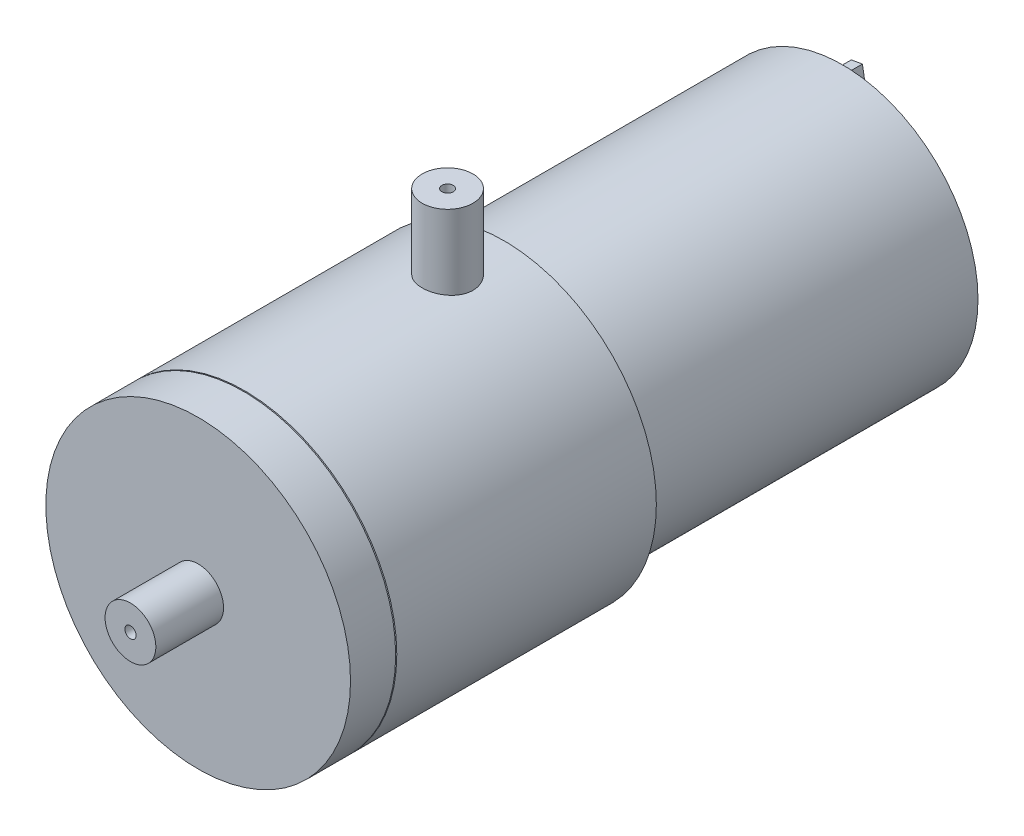
ISO-10303-21;
HEADER;
FILE_DESCRIPTION(('STEP AP214'),'2;1');
FILE_NAME('part.step','',(''),(''),'','','');
FILE_SCHEMA(('AUTOMOTIVE_DESIGN { 1 0 10303 214 1 1 1 1 }'));
ENDSEC;
DATA;
#1=APPLICATION_CONTEXT('core data for automotive mechanical design processes');
#2=APPLICATION_PROTOCOL_DEFINITION('international standard','automotive_design',2000,#1);
#3=PRODUCT_CONTEXT('',#1,'mechanical');
#4=PRODUCT('Part','Part','',(#3));
#5=PRODUCT_RELATED_PRODUCT_CATEGORY('part','',(#4));
#6=PRODUCT_DEFINITION_FORMATION('','',#4);
#7=PRODUCT_DEFINITION_CONTEXT('part definition',#1,'design');
#8=PRODUCT_DEFINITION('design','',#6,#7);
#9=PRODUCT_DEFINITION_SHAPE('','',#8);
#10=(LENGTH_UNIT() NAMED_UNIT(*) SI_UNIT(.MILLI.,.METRE.));
#11=(NAMED_UNIT(*) PLANE_ANGLE_UNIT() SI_UNIT($,.RADIAN.));
#12=(NAMED_UNIT(*) SI_UNIT($,.STERADIAN.) SOLID_ANGLE_UNIT());
#13=UNCERTAINTY_MEASURE_WITH_UNIT(LENGTH_MEASURE(1.E-05),#10,'distance_accuracy_value','');
#14=(GEOMETRIC_REPRESENTATION_CONTEXT(3) GLOBAL_UNCERTAINTY_ASSIGNED_CONTEXT((#13)) GLOBAL_UNIT_ASSIGNED_CONTEXT((#10,
#11,#12)) REPRESENTATION_CONTEXT('',''));
#15=CARTESIAN_POINT('',(0.,0.,0.));
#16=DIRECTION('',(0.,0.,1.));
#17=DIRECTION('',(1.,0.,0.));
#18=AXIS2_PLACEMENT_3D('',#15,#16,#17);
#19=CARTESIAN_POINT('',(0.,0.,-28.));
#20=DIRECTION('',(0.,0.,-1.));
#21=DIRECTION('',(-1.,0.,0.));
#22=AXIS2_PLACEMENT_3D('',#19,#20,#21);
#23=PLANE('',#22);
#24=CARTESIAN_POINT('',(0.,0.,-28.));
#25=DIRECTION('',(0.,0.,-1.));
#26=DIRECTION('',(-1.,0.,0.));
#27=AXIS2_PLACEMENT_3D('',#24,#25,#26);
#28=CIRCLE('',#27,3.);
#29=CARTESIAN_POINT('',(-3.,0.,-28.));
#30=VERTEX_POINT('',#29);
#31=EDGE_CURVE('E241',#30,#30,#28,.T.);
#32=ORIENTED_EDGE('',*,*,#31,.F.);
#33=EDGE_LOOP('',(#32));
#34=FACE_BOUND('',#33,.T.);
#35=CARTESIAN_POINT('',(0.,0.,-28.));
#36=DIRECTION('',(0.,0.,-1.));
#37=DIRECTION('',(-1.,0.,0.));
#38=AXIS2_PLACEMENT_3D('',#35,#36,#37);
#39=CIRCLE('',#38,11.5);
#40=CARTESIAN_POINT('',(-11.5,0.,-28.));
#41=VERTEX_POINT('',#40);
#42=EDGE_CURVE('E244',#41,#41,#39,.T.);
#43=ORIENTED_EDGE('',*,*,#42,.T.);
#44=EDGE_LOOP('',(#43));
#45=FACE_BOUND('',#44,.T.);
#46=DIRECTION('',(-0.984807753012208,-0.173648177666933,0.));
#47=VECTOR('',#46,1.);
#48=CARTESIAN_POINT('',(2.22888565317541,-9.76125344128861,-28.));
#49=LINE('',#48,#47);
#50=CARTESIAN_POINT('',(2.22888565317541,-9.76125344128861,-28.));
#51=VERTEX_POINT('',#50);
#52=CARTESIAN_POINT('',(1.2440779001632,-9.93490161895555,-28.));
#53=VERTEX_POINT('',#52);
#54=EDGE_CURVE('E206',#51,#53,#49,.T.);
#55=ORIENTED_EDGE('',*,*,#54,.F.);
#56=DIRECTION('',(0.173648177666931,-0.984807753012208,0.));
#57=VECTOR('',#56,1.);
#58=CARTESIAN_POINT('',(1.53429294250769,-5.82202242923978,-28.));
#59=LINE('',#58,#57);
#60=CARTESIAN_POINT('',(1.53429294250769,-5.82202242923978,-28.));
#61=VERTEX_POINT('',#60);
#62=EDGE_CURVE('E192',#61,#51,#59,.T.);
#63=ORIENTED_EDGE('',*,*,#62,.F.);
#64=DIRECTION('',(0.984807753012208,0.173648177666931,0.));
#65=VECTOR('',#64,1.);
#66=CARTESIAN_POINT('',(1.53429294250769,-5.82202242923978,-28.));
#67=LINE('',#66,#65);
#68=CARTESIAN_POINT('',(0.549485189495479,-5.99567060690671,-28.));
#69=VERTEX_POINT('',#68);
#70=EDGE_CURVE('E197',#69,#61,#67,.T.);
#71=ORIENTED_EDGE('',*,*,#70,.F.);
#72=DIRECTION('',(-0.17364817766693,0.984807753012208,0.));
#73=VECTOR('',#72,1.);
#74=CARTESIAN_POINT('',(0.549485189495479,-5.99567060690671,-28.));
#75=LINE('',#74,#73);
#76=EDGE_CURVE('E208',#53,#69,#75,.T.);
#77=ORIENTED_EDGE('',*,*,#76,.F.);
#78=EDGE_LOOP('',(#55,#63,#71,#77));
#79=FACE_BOUND('',#78,.T.);
#80=DIRECTION('',(-0.173648177666931,0.984807753012208,0.));
#81=VECTOR('',#80,1.);
#82=CARTESIAN_POINT('',(-1.53429294250769,5.82202242923978,-28.));
#83=LINE('',#82,#81);
#84=CARTESIAN_POINT('',(-1.53429294250769,5.82202242923978,-28.));
#85=VERTEX_POINT('',#84);
#86=CARTESIAN_POINT('',(-2.22888565317541,9.76125344128861,-28.));
#87=VERTEX_POINT('',#86);
#88=EDGE_CURVE('E179',#85,#87,#83,.T.);
#89=ORIENTED_EDGE('',*,*,#88,.F.);
#90=DIRECTION('',(-0.984807753012208,-0.173648177666931,0.));
#91=VECTOR('',#90,1.);
#92=CARTESIAN_POINT('',(-0.549485189495481,5.99567060690671,-28.));
#93=LINE('',#92,#91);
#94=CARTESIAN_POINT('',(-0.549485189495481,5.99567060690671,-28.));
#95=VERTEX_POINT('',#94);
#96=EDGE_CURVE('E162',#95,#85,#93,.T.);
#97=ORIENTED_EDGE('',*,*,#96,.F.);
#98=DIRECTION('',(0.173648177666931,-0.984807753012208,0.));
#99=VECTOR('',#98,1.);
#100=CARTESIAN_POINT('',(-0.549485189495481,5.99567060690671,-28.));
#101=LINE('',#100,#99);
#102=CARTESIAN_POINT('',(-1.2440779001632,9.93490161895554,-28.));
#103=VERTEX_POINT('',#102);
#104=EDGE_CURVE('E170',#103,#95,#101,.T.);
#105=ORIENTED_EDGE('',*,*,#104,.F.);
#106=DIRECTION('',(0.984807753012208,0.17364817766693,0.));
#107=VECTOR('',#106,1.);
#108=CARTESIAN_POINT('',(-1.2440779001632,9.93490161895554,-28.));
#109=LINE('',#108,#107);
#110=EDGE_CURVE('E181',#87,#103,#109,.T.);
#111=ORIENTED_EDGE('',*,*,#110,.F.);
#112=EDGE_LOOP('',(#89,#97,#105,#111));
#113=FACE_BOUND('',#112,.T.);
#114=ADVANCED_FACE('F33',(#34,#45,#79,#113),#23,.T.);
#115=CARTESIAN_POINT('',(0.,0.,23.));
#116=DIRECTION('',(0.,0.,-1.));
#117=DIRECTION('',(-1.,0.,0.));
#118=AXIS2_PLACEMENT_3D('',#115,#116,#117);
#119=CYLINDRICAL_SURFACE('',#118,13.5);
#120=CARTESIAN_POINT('',(0.,0.,0.));
#121=DIRECTION('',(0.,0.,1.));
#122=DIRECTION('',(1.,0.,0.));
#123=AXIS2_PLACEMENT_3D('',#120,#121,#122);
#124=CIRCLE('',#123,13.5);
#125=CARTESIAN_POINT('',(13.5,0.,0.));
#126=VERTEX_POINT('',#125);
#127=EDGE_CURVE('E267',#126,#126,#124,.T.);
#128=ORIENTED_EDGE('',*,*,#127,.T.);
#129=EDGE_LOOP('',(#128));
#130=FACE_BOUND('',#129,.T.);
#131=CARTESIAN_POINT('',(0.,0.,23.));
#132=DIRECTION('',(0.,0.,1.));
#133=DIRECTION('',(1.,0.,0.));
#134=AXIS2_PLACEMENT_3D('',#131,#132,#133);
#135=CIRCLE('',#134,13.5);
#136=CARTESIAN_POINT('',(13.5,0.,23.));
#137=VERTEX_POINT('',#136);
#138=EDGE_CURVE('E270',#137,#137,#135,.T.);
#139=ORIENTED_EDGE('',*,*,#138,.F.);
#140=EDGE_LOOP('',(#139));
#141=FACE_BOUND('',#140,.T.);
#142=CARTESIAN_POINT('',(0.,13.5,2.75));
#143=CARTESIAN_POINT('',(-0.125451814462393,13.4999978505194,2.75000503005304));
#144=CARTESIAN_POINT('',(-0.250972093654939,13.4982331012173,2.76052754747203));
#145=CARTESIAN_POINT('',(-0.498492199505738,13.4913631044725,2.80232209288879));
#146=CARTESIAN_POINT('',(-0.620488681163322,13.486254785315,2.83361320122044));
#147=CARTESIAN_POINT('',(-0.857344272491379,13.4732706141281,2.91597390373348));
#148=CARTESIAN_POINT('',(-0.97220913158871,13.4653970264327,2.96702731907652));
#149=CARTESIAN_POINT('',(-1.19172765778015,13.4477480437386,3.08742106284716));
#150=CARTESIAN_POINT('',(-1.29638249089073,13.4379728662899,3.1567592997347));
#151=CARTESIAN_POINT('',(-1.49352535286251,13.4174998571248,3.31245957543841));
#152=CARTESIAN_POINT('',(-1.58590161318147,13.4067948463337,3.39896220317252));
#153=CARTESIAN_POINT('',(-1.75489964879393,13.3857236418906,3.58623317162553));
#154=CARTESIAN_POINT('',(-1.83152042945187,13.375357469664,3.68700241231095));
#155=CARTESIAN_POINT('',(-1.96728041304462,13.356068091838,3.90071386957735));
#156=CARTESIAN_POINT('',(-2.0263090975749,13.3471541618247,4.01372720312428));
#157=CARTESIAN_POINT('',(-2.1245025288701,13.3318781081521,4.24823860787056));
#158=CARTESIAN_POINT('',(-2.16366861740905,13.3255158121288,4.36973610530987));
#159=CARTESIAN_POINT('',(-2.22067294000633,13.3161348315848,4.61658224737088));
#160=CARTESIAN_POINT('',(-2.23870412622186,13.3130859163713,4.74188516285125));
#161=CARTESIAN_POINT('',(-2.25352505276089,13.3105854504298,4.99377224919512));
#162=CARTESIAN_POINT('',(-2.2503162963501,13.3111336451149,5.12035632875057));
#163=CARTESIAN_POINT('',(-2.22290558855654,13.315737859772,5.3698350751479));
#164=CARTESIAN_POINT('',(-2.1989203937008,13.3197576598703,5.49275432319071));
#165=CARTESIAN_POINT('',(-2.1309778263631,13.3307954568991,5.73279918604622));
#166=CARTESIAN_POINT('',(-2.08701976888777,13.3378135566594,5.84992460199969));
#167=CARTESIAN_POINT('',(-1.98015952148452,13.3540963140069,6.07570594109683));
#168=CARTESIAN_POINT('',(-1.91716732249174,13.3633716039659,6.1843184654731));
#169=CARTESIAN_POINT('',(-1.77409081580169,13.3831162657351,6.38951396048455));
#170=CARTESIAN_POINT('',(-1.69400512858886,13.3935857338886,6.48609595920944));
#171=CARTESIAN_POINT('',(-1.51783399094315,13.4146982509181,6.66574347722661));
#172=CARTESIAN_POINT('',(-1.42156256748581,13.4253418430849,6.74862666668608));
#173=CARTESIAN_POINT('',(-1.21638172408348,13.4454834125705,6.89708998639881));
#174=CARTESIAN_POINT('',(-1.10747222271578,13.4549813825077,6.96267000516491));
#175=CARTESIAN_POINT('',(-0.879935324550039,13.4717750360362,7.07468200442265));
#176=CARTESIAN_POINT('',(-0.761299853008194,13.479068865667,7.12109787739813));
#177=CARTESIAN_POINT('',(-0.517768511042457,13.4906175271139,7.19329479372138));
#178=CARTESIAN_POINT('',(-0.39287316526152,13.4948726131543,7.21907756327635));
#179=CARTESIAN_POINT('',(-0.14193891117146,13.4998301685842,7.24902922261502));
#180=CARTESIAN_POINT('',(-0.0159306634359089,13.5005737771151,7.25344841462505));
#181=CARTESIAN_POINT('',(0.2350257956009,13.4985372697905,7.24121479001469));
#182=CARTESIAN_POINT('',(0.359974047502836,13.4957572895171,7.22456278417964));
#183=CARTESIAN_POINT('',(0.604490557992088,13.4870114424438,7.17086763559807));
#184=CARTESIAN_POINT('',(0.724086781546842,13.4810649432118,7.13394841244889));
#185=CARTESIAN_POINT('',(0.955392196374399,13.4666501800982,7.04089893362042));
#186=CARTESIAN_POINT('',(1.06710094431875,13.4581817746082,6.98476759912825));
#187=CARTESIAN_POINT('',(1.28054762052206,13.4395606467217,6.85431398777289));
#188=CARTESIAN_POINT('',(1.38218872584343,13.4293937029832,6.77983535944947));
#189=CARTESIAN_POINT('',(1.57161922695242,13.4085462065271,6.61501641615345));
#190=CARTESIAN_POINT('',(1.65940761572693,13.3978656165439,6.524674949051));
#191=CARTESIAN_POINT('',(1.8195685016922,13.3770615771226,6.32957220673572));
#192=CARTESIAN_POINT('',(1.89177188500234,13.366945045234,6.22467125103703));
#193=CARTESIAN_POINT('',(2.01753207926549,13.348543768001,6.00408232777532));
#194=CARTESIAN_POINT('',(2.07108948129284,13.3402589645942,5.88839470229525));
#195=CARTESIAN_POINT('',(2.15778449832583,13.3265110832793,5.64998924046908));
#196=CARTESIAN_POINT('',(2.19100628929315,13.3210363887996,5.52730271447256));
#197=CARTESIAN_POINT('',(2.23635190840045,13.3134994515173,5.27799188370041));
#198=CARTESIAN_POINT('',(2.24847757075155,13.3114369120445,5.15136792224115));
#199=CARTESIAN_POINT('',(2.25123557944262,13.3109705977561,4.89946535063383));
#200=CARTESIAN_POINT('',(2.24213412251267,13.3125215085508,4.77418965928224));
#201=CARTESIAN_POINT('',(2.20327185506116,13.3190080330836,4.52697867675431));
#202=CARTESIAN_POINT('',(2.17351111150123,13.3239436358509,4.40504337475232));
#203=CARTESIAN_POINT('',(2.09427704063541,13.3366262065355,4.16807740643665));
#204=CARTESIAN_POINT('',(2.0448266315404,13.344369904977,4.05303889094958));
#205=CARTESIAN_POINT('',(1.92764430352432,13.3617993202999,3.83284789772464));
#206=CARTESIAN_POINT('',(1.85991147787371,13.3714851334956,3.72769591066508));
#207=CARTESIAN_POINT('',(1.70713699593494,13.3918510864106,3.52891797520302));
#208=CARTESIAN_POINT('',(1.62189950723428,13.4025416601867,3.43544358496975));
#209=CARTESIAN_POINT('',(1.43694812824221,13.4236293512476,3.26403355597256));
#210=CARTESIAN_POINT('',(1.33723090162137,13.4340264002389,3.18610150822565));
#211=CARTESIAN_POINT('',(1.12533225267625,13.45343876678,3.04749655862005));
#212=CARTESIAN_POINT('',(1.01306950877954,13.4624440462779,2.98694656461834));
#213=CARTESIAN_POINT('',(0.779861762441082,13.477960508416,2.88565746385107));
#214=CARTESIAN_POINT('',(0.658925545347008,13.4844741735973,2.84489862702827));
#215=CARTESIAN_POINT('',(0.44793297904086,13.4928521174966,2.793195253286));
#216=CARTESIAN_POINT('',(0.359152947268602,13.4955182454602,2.77702297734563));
#217=CARTESIAN_POINT('',(0.180260379287827,13.4990929438751,2.75542363593972));
#218=CARTESIAN_POINT('',(0.0901478660476444,13.5000015445858,2.74999638547638));
#219=CARTESIAN_POINT('',(0.,13.5,2.75));
#220=B_SPLINE_CURVE_WITH_KNOTS('',3,(#142,#143,#144,#145,#146,#147,#148,#149,#150,#151,#152,
#153,#154,#155,#156,#157,#158,#159,#160,#161,#162,#163,#164,#165,#166,#167,#168,#169,#170,#171,
#172,#173,#174,#175,#176,#177,#178,#179,#180,#181,#182,#183,#184,#185,#186,#187,#188,#189,#190,
#191,#192,#193,#194,#195,#196,#197,#198,#199,#200,#201,#202,#203,#204,#205,#206,#207,#208,#209,
#210,#211,#212,#213,#214,#215,#216,#217,#218,#219),.UNSPECIFIED.,.T.,.F.,(4,2,2,2,2,2,2,2,2,2,2,
2,2,2,2,2,2,2,2,2,2,2,2,2,2,2,2,2,2,2,2,2,2,2,2,2,2,2,4),(0.,0.376025926444659,
0.752397791125878,1.12846218032274,1.50448357140731,1.88372241956099,2.26298520152871,
2.64458268741456,3.02615439188563,3.40421469393081,3.78224823888798,4.15638469584368,
4.53053398522843,4.90648100969302,5.28245838612516,5.66309492920194,6.04373392472263,
6.42469220024313,6.80561860069034,7.18207095142257,7.55850881732274,7.93267026305774,
8.3068527224346,8.68434143064321,9.06185756748854,9.44328439806857,9.82469913638348,
10.2045242010759,10.5843162400796,10.9593711857043,11.3344249156932,11.709043364036,
12.083680395264,12.4627624577405,12.8419320049108,13.2237200844648,13.6051267691706,
13.8753382334762,14.1455450454927),.UNSPECIFIED.);
#221=CARTESIAN_POINT('',(0.,13.5,2.75));
#222=VERTEX_POINT('',#221);
#223=EDGE_CURVE('E11',#222,#222,#220,.T.);
#224=ORIENTED_EDGE('',*,*,#223,.F.);
#225=EDGE_LOOP('',(#224));
#226=FACE_BOUND('',#225,.T.);
#227=ADVANCED_FACE('F310',(#130,#141,#226),#119,.T.);
#228=CARTESIAN_POINT('',(0.,0.,23.));
#229=DIRECTION('',(0.,0.,1.));
#230=DIRECTION('',(1.,0.,0.));
#231=AXIS2_PLACEMENT_3D('',#228,#229,#230);
#232=PLANE('',#231);
#233=CARTESIAN_POINT('',(0.,0.,23.));
#234=DIRECTION('',(0.,0.,1.));
#235=DIRECTION('',(1.,0.,0.));
#236=AXIS2_PLACEMENT_3D('',#233,#234,#235);
#237=CIRCLE('',#236,12.5);
#238=CARTESIAN_POINT('',(12.5,0.,23.));
#239=VERTEX_POINT('',#238);
#240=EDGE_CURVE('E258',#239,#239,#237,.T.);
#241=ORIENTED_EDGE('',*,*,#240,.F.);
#242=EDGE_LOOP('',(#241));
#243=FACE_BOUND('',#242,.T.);
#244=ORIENTED_EDGE('',*,*,#138,.T.);
#245=EDGE_LOOP('',(#244));
#246=FACE_BOUND('',#245,.T.);
#247=ADVANCED_FACE('F345',(#243,#246),#232,.T.);
#248=CARTESIAN_POINT('',(0.,0.,0.));
#249=DIRECTION('',(0.,0.,1.));
#250=DIRECTION('',(1.,0.,0.));
#251=AXIS2_PLACEMENT_3D('',#248,#249,#250);
#252=PLANE('',#251);
#253=CARTESIAN_POINT('',(0.,0.,0.));
#254=DIRECTION('',(0.,0.,-1.));
#255=DIRECTION('',(-1.,0.,0.));
#256=AXIS2_PLACEMENT_3D('',#253,#254,#255);
#257=CIRCLE('',#256,12.);
#258=CARTESIAN_POINT('',(-12.,0.,0.));
#259=VERTEX_POINT('',#258);
#260=EDGE_CURVE('E240',#259,#259,#257,.T.);
#261=ORIENTED_EDGE('',*,*,#260,.F.);
#262=EDGE_LOOP('',(#261));
#263=FACE_BOUND('',#262,.T.);
#264=ORIENTED_EDGE('',*,*,#127,.F.);
#265=EDGE_LOOP('',(#264));
#266=FACE_BOUND('',#265,.T.);
#267=ADVANCED_FACE('F343',(#263,#266),#252,.F.);
#268=CARTESIAN_POINT('',(0.,0.,23.1));
#269=DIRECTION('',(0.,0.,-1.));
#270=DIRECTION('',(-1.,0.,0.));
#271=AXIS2_PLACEMENT_3D('',#268,#269,#270);
#272=CYLINDRICAL_SURFACE('',#271,12.5);
#273=CARTESIAN_POINT('',(0.,0.,23.1));
#274=DIRECTION('',(0.,0.,1.));
#275=DIRECTION('',(1.,0.,0.));
#276=AXIS2_PLACEMENT_3D('',#273,#274,#275);
#277=CIRCLE('',#276,12.5);
#278=CARTESIAN_POINT('',(12.5,0.,23.1));
#279=VERTEX_POINT('',#278);
#280=EDGE_CURVE('E262',#279,#279,#277,.T.);
#281=ORIENTED_EDGE('',*,*,#280,.F.);
#282=EDGE_LOOP('',(#281));
#283=FACE_BOUND('',#282,.T.);
#284=ORIENTED_EDGE('',*,*,#240,.T.);
#285=EDGE_LOOP('',(#284));
#286=FACE_BOUND('',#285,.T.);
#287=ADVANCED_FACE('F339',(#283,#286),#272,.T.);
#288=CARTESIAN_POINT('',(0.,0.,27.1));
#289=DIRECTION('',(0.,0.,-1.));
#290=DIRECTION('',(-1.,0.,0.));
#291=AXIS2_PLACEMENT_3D('',#288,#289,#290);
#292=CYLINDRICAL_SURFACE('',#291,13.5);
#293=CARTESIAN_POINT('',(0.,0.,27.1));
#294=DIRECTION('',(0.,0.,1.));
#295=DIRECTION('',(1.,0.,0.));
#296=AXIS2_PLACEMENT_3D('',#293,#294,#295);
#297=CIRCLE('',#296,13.5);
#298=CARTESIAN_POINT('',(13.5,0.,27.1));
#299=VERTEX_POINT('',#298);
#300=EDGE_CURVE('E259',#299,#299,#297,.T.);
#301=ORIENTED_EDGE('',*,*,#300,.F.);
#302=EDGE_LOOP('',(#301));
#303=FACE_BOUND('',#302,.T.);
#304=CARTESIAN_POINT('',(0.,0.,23.1));
#305=DIRECTION('',(0.,0.,1.));
#306=DIRECTION('',(1.,0.,0.));
#307=AXIS2_PLACEMENT_3D('',#304,#305,#306);
#308=CIRCLE('',#307,13.5);
#309=CARTESIAN_POINT('',(13.5,0.,23.1));
#310=VERTEX_POINT('',#309);
#311=EDGE_CURVE('E255',#310,#310,#308,.T.);
#312=ORIENTED_EDGE('',*,*,#311,.T.);
#313=EDGE_LOOP('',(#312));
#314=FACE_BOUND('',#313,.T.);
#315=ADVANCED_FACE('F332',(#303,#314),#292,.T.);
#316=CARTESIAN_POINT('',(0.,0.,27.1));
#317=DIRECTION('',(0.,0.,1.));
#318=DIRECTION('',(1.,0.,0.));
#319=AXIS2_PLACEMENT_3D('',#316,#317,#318);
#320=PLANE('',#319);
#321=CARTESIAN_POINT('',(0.,0.,27.1));
#322=DIRECTION('',(0.,0.,1.));
#323=DIRECTION('',(1.,0.,0.));
#324=AXIS2_PLACEMENT_3D('',#321,#322,#323);
#325=CIRCLE('',#324,2.25);
#326=CARTESIAN_POINT('',(2.25,0.,27.1));
#327=VERTEX_POINT('',#326);
#328=EDGE_CURVE('E45',#327,#327,#325,.T.);
#329=ORIENTED_EDGE('',*,*,#328,.F.);
#330=EDGE_LOOP('',(#329));
#331=FACE_BOUND('',#330,.T.);
#332=ORIENTED_EDGE('',*,*,#300,.T.);
#333=EDGE_LOOP('',(#332));
#334=FACE_BOUND('',#333,.T.);
#335=ADVANCED_FACE('F329',(#331,#334),#320,.T.);
#336=CARTESIAN_POINT('',(0.,0.,23.1));
#337=DIRECTION('',(0.,0.,1.));
#338=DIRECTION('',(1.,0.,0.));
#339=AXIS2_PLACEMENT_3D('',#336,#337,#338);
#340=PLANE('',#339);
#341=ORIENTED_EDGE('',*,*,#280,.T.);
#342=EDGE_LOOP('',(#341));
#343=FACE_BOUND('',#342,.T.);
#344=ORIENTED_EDGE('',*,*,#311,.F.);
#345=EDGE_LOOP('',(#344));
#346=FACE_BOUND('',#345,.T.);
#347=ADVANCED_FACE('F327',(#343,#346),#340,.F.);
#348=CARTESIAN_POINT('',(0.,0.,-30.));
#349=DIRECTION('',(0.,0.,1.));
#350=DIRECTION('',(1.,0.,0.));
#351=AXIS2_PLACEMENT_3D('',#348,#349,#350);
#352=CYLINDRICAL_SURFACE('',#351,12.);
#353=CARTESIAN_POINT('',(0.,0.,-30.));
#354=DIRECTION('',(0.,0.,-1.));
#355=DIRECTION('',(-1.,0.,0.));
#356=AXIS2_PLACEMENT_3D('',#353,#354,#355);
#357=CIRCLE('',#356,12.);
#358=CARTESIAN_POINT('',(-12.,0.,-30.));
#359=VERTEX_POINT('',#358);
#360=EDGE_CURVE('E248',#359,#359,#357,.T.);
#361=ORIENTED_EDGE('',*,*,#360,.F.);
#362=EDGE_LOOP('',(#361));
#363=FACE_BOUND('',#362,.T.);
#364=ORIENTED_EDGE('',*,*,#260,.T.);
#365=EDGE_LOOP('',(#364));
#366=FACE_BOUND('',#365,.T.);
#367=ADVANCED_FACE('F323',(#363,#366),#352,.T.);
#368=CARTESIAN_POINT('',(0.,0.,-30.));
#369=DIRECTION('',(0.,0.,-1.));
#370=DIRECTION('',(-1.,0.,0.));
#371=AXIS2_PLACEMENT_3D('',#368,#369,#370);
#372=PLANE('',#371);
#373=CARTESIAN_POINT('',(0.,0.,-30.));
#374=DIRECTION('',(0.,0.,-1.));
#375=DIRECTION('',(-1.,0.,0.));
#376=AXIS2_PLACEMENT_3D('',#373,#374,#375);
#377=CIRCLE('',#376,11.5);
#378=CARTESIAN_POINT('',(-11.5,0.,-30.));
#379=VERTEX_POINT('',#378);
#380=EDGE_CURVE('E245',#379,#379,#377,.T.);
#381=ORIENTED_EDGE('',*,*,#380,.F.);
#382=EDGE_LOOP('',(#381));
#383=FACE_BOUND('',#382,.T.);
#384=ORIENTED_EDGE('',*,*,#360,.T.);
#385=EDGE_LOOP('',(#384));
#386=FACE_BOUND('',#385,.T.);
#387=ADVANCED_FACE('F319',(#383,#386),#372,.T.);
#388=CARTESIAN_POINT('',(0.,0.,-28.));
#389=DIRECTION('',(0.,0.,-1.));
#390=DIRECTION('',(-1.,0.,0.));
#391=AXIS2_PLACEMENT_3D('',#388,#389,#390);
#392=CYLINDRICAL_SURFACE('',#391,3.);
#393=ORIENTED_EDGE('',*,*,#31,.T.);
#394=EDGE_LOOP('',(#393));
#395=FACE_BOUND('',#394,.T.);
#396=CARTESIAN_POINT('',(0.,0.,-30.));
#397=DIRECTION('',(0.,0.,-1.));
#398=DIRECTION('',(-1.,0.,0.));
#399=AXIS2_PLACEMENT_3D('',#396,#397,#398);
#400=CIRCLE('',#399,3.);
#401=CARTESIAN_POINT('',(-3.,0.,-30.));
#402=VERTEX_POINT('',#401);
#403=EDGE_CURVE('E237',#402,#402,#400,.T.);
#404=ORIENTED_EDGE('',*,*,#403,.F.);
#405=EDGE_LOOP('',(#404));
#406=FACE_BOUND('',#405,.T.);
#407=ADVANCED_FACE('F315',(#395,#406),#392,.T.);
#408=CARTESIAN_POINT('',(0.,0.,-28.));
#409=DIRECTION('',(0.,0.,-1.));
#410=DIRECTION('',(-1.,0.,0.));
#411=AXIS2_PLACEMENT_3D('',#408,#409,#410);
#412=CYLINDRICAL_SURFACE('',#411,11.5);
#413=ORIENTED_EDGE('',*,*,#42,.F.);
#414=EDGE_LOOP('',(#413));
#415=FACE_BOUND('',#414,.T.);
#416=ORIENTED_EDGE('',*,*,#380,.T.);
#417=EDGE_LOOP('',(#416));
#418=FACE_BOUND('',#417,.T.);
#419=ADVANCED_FACE('F312',(#415,#418),#412,.F.);
#420=DIRECTION('',(0.,1.,0.));
#421=VECTOR('',#420,1.);
#422=CARTESIAN_POINT('',(-0.25,0.25,-30.));
#423=LINE('',#422,#421);
#424=CARTESIAN_POINT('',(-0.25,-0.25,-30.));
#425=VERTEX_POINT('',#424);
#426=CARTESIAN_POINT('',(-0.25,0.25,-30.));
#427=VERTEX_POINT('',#426);
#428=EDGE_CURVE('E52',#425,#427,#423,.T.);
#429=ORIENTED_EDGE('',*,*,#428,.F.);
#430=DIRECTION('',(-1.,0.,0.));
#431=VECTOR('',#430,1.);
#432=CARTESIAN_POINT('',(0.25,-0.25,-30.));
#433=LINE('',#432,#431);
#434=CARTESIAN_POINT('',(0.25,-0.25,-30.));
#435=VERTEX_POINT('',#434);
#436=EDGE_CURVE('E147',#435,#425,#433,.T.);
#437=ORIENTED_EDGE('',*,*,#436,.F.);
#438=DIRECTION('',(0.,-1.,0.));
#439=VECTOR('',#438,1.);
#440=CARTESIAN_POINT('',(0.25,0.25,-30.));
#441=LINE('',#440,#439);
#442=CARTESIAN_POINT('',(0.25,0.25,-30.));
#443=VERTEX_POINT('',#442);
#444=EDGE_CURVE('E150',#443,#435,#441,.T.);
#445=ORIENTED_EDGE('',*,*,#444,.F.);
#446=DIRECTION('',(1.,0.,0.));
#447=VECTOR('',#446,1.);
#448=CARTESIAN_POINT('',(0.25,0.25,-30.));
#449=LINE('',#448,#447);
#450=EDGE_CURVE('E156',#427,#443,#449,.T.);
#451=ORIENTED_EDGE('',*,*,#450,.F.);
#452=EDGE_LOOP('',(#429,#437,#445,#451));
#453=FACE_BOUND('',#452,.T.);
#454=ORIENTED_EDGE('',*,*,#403,.T.);
#455=EDGE_LOOP('',(#454));
#456=FACE_BOUND('',#455,.T.);
#457=ADVANCED_FACE('F303',(#453,#456),#372,.T.);
#458=CARTESIAN_POINT('',(0.,0.,33.1));
#459=DIRECTION('',(0.,0.,1.));
#460=DIRECTION('',(1.,0.,0.));
#461=AXIS2_PLACEMENT_3D('',#458,#459,#460);
#462=PLANE('',#461);
#463=CARTESIAN_POINT('',(0.,0.,33.1));
#464=DIRECTION('',(0.,0.,1.));
#465=DIRECTION('',(1.,0.,0.));
#466=AXIS2_PLACEMENT_3D('',#463,#464,#465);
#467=CIRCLE('',#466,2.25);
#468=CARTESIAN_POINT('',(2.25,0.,33.1));
#469=VERTEX_POINT('',#468);
#470=EDGE_CURVE('E231',#469,#469,#467,.T.);
#471=ORIENTED_EDGE('',*,*,#470,.T.);
#472=EDGE_LOOP('',(#471));
#473=FACE_BOUND('',#472,.T.);
#474=CARTESIAN_POINT('',(0.,0.,33.1));
#475=DIRECTION('',(0.,0.,1.));
#476=DIRECTION('',(1.,0.,0.));
#477=AXIS2_PLACEMENT_3D('',#474,#475,#476);
#478=CIRCLE('',#477,0.5);
#479=CARTESIAN_POINT('',(0.5,0.,33.1));
#480=VERTEX_POINT('',#479);
#481=EDGE_CURVE('E228',#480,#480,#478,.T.);
#482=ORIENTED_EDGE('',*,*,#481,.F.);
#483=EDGE_LOOP('',(#482));
#484=FACE_BOUND('',#483,.T.);
#485=ADVANCED_FACE('F300',(#473,#484),#462,.T.);
#486=CARTESIAN_POINT('',(0.,0.,33.1));
#487=DIRECTION('',(0.,0.,-1.));
#488=DIRECTION('',(-1.,0.,0.));
#489=AXIS2_PLACEMENT_3D('',#486,#487,#488);
#490=CYLINDRICAL_SURFACE('',#489,2.25);
#491=ORIENTED_EDGE('',*,*,#470,.F.);
#492=EDGE_LOOP('',(#491));
#493=FACE_BOUND('',#492,.T.);
#494=ORIENTED_EDGE('',*,*,#328,.T.);
#495=EDGE_LOOP('',(#494));
#496=FACE_BOUND('',#495,.T.);
#497=ADVANCED_FACE('F298',(#493,#496),#490,.T.);
#498=CARTESIAN_POINT('',(0.,0.,33.1));
#499=DIRECTION('',(0.,0.,-1.));
#500=DIRECTION('',(-1.,0.,0.));
#501=AXIS2_PLACEMENT_3D('',#498,#499,#500);
#502=CYLINDRICAL_SURFACE('',#501,0.5);
#503=ORIENTED_EDGE('',*,*,#481,.T.);
#504=EDGE_LOOP('',(#503));
#505=FACE_BOUND('',#504,.T.);
#506=CARTESIAN_POINT('',(0.,0.,27.1));
#507=DIRECTION('',(0.,0.,1.));
#508=DIRECTION('',(1.,0.,0.));
#509=AXIS2_PLACEMENT_3D('',#506,#507,#508);
#510=CIRCLE('',#509,0.5);
#511=CARTESIAN_POINT('',(0.5,0.,27.1));
#512=VERTEX_POINT('',#511);
#513=EDGE_CURVE('E232',#512,#512,#510,.T.);
#514=ORIENTED_EDGE('',*,*,#513,.F.);
#515=EDGE_LOOP('',(#514));
#516=FACE_BOUND('',#515,.T.);
#517=ADVANCED_FACE('F295',(#505,#516),#502,.F.);
#518=ORIENTED_EDGE('',*,*,#513,.T.);
#519=EDGE_LOOP('',(#518));
#520=FACE_BOUND('',#519,.T.);
#521=ADVANCED_FACE('F293',(#520),#320,.T.);
#522=CARTESIAN_POINT('',(0.,20.,5.));
#523=DIRECTION('',(0.,-1.,0.));
#524=DIRECTION('',(0.,0.,-1.));
#525=AXIS2_PLACEMENT_3D('',#522,#523,#524);
#526=CYLINDRICAL_SURFACE('',#525,2.25);
#527=CARTESIAN_POINT('',(0.,20.,5.));
#528=DIRECTION('',(0.,1.,0.));
#529=DIRECTION('',(0.,0.,1.));
#530=AXIS2_PLACEMENT_3D('',#527,#528,#529);
#531=CIRCLE('',#530,2.25);
#532=CARTESIAN_POINT('',(0.,20.,7.25));
#533=VERTEX_POINT('',#532);
#534=EDGE_CURVE('E224',#533,#533,#531,.T.);
#535=ORIENTED_EDGE('',*,*,#534,.F.);
#536=EDGE_LOOP('',(#535));
#537=FACE_BOUND('',#536,.T.);
#538=ORIENTED_EDGE('',*,*,#223,.T.);
#539=EDGE_LOOP('',(#538));
#540=FACE_BOUND('',#539,.T.);
#541=ADVANCED_FACE('F284',(#537,#540),#526,.T.);
#542=CARTESIAN_POINT('',(0.,20.,5.));
#543=DIRECTION('',(0.,-1.,0.));
#544=DIRECTION('',(0.,0.,-1.));
#545=AXIS2_PLACEMENT_3D('',#542,#543,#544);
#546=CYLINDRICAL_SURFACE('',#545,0.5);
#547=CARTESIAN_POINT('',(0.,20.,5.));
#548=DIRECTION('',(0.,1.,0.));
#549=DIRECTION('',(0.,0.,1.));
#550=AXIS2_PLACEMENT_3D('',#547,#548,#549);
#551=CIRCLE('',#550,0.5);
#552=CARTESIAN_POINT('',(0.,20.,5.5));
#553=VERTEX_POINT('',#552);
#554=EDGE_CURVE('E221',#553,#553,#551,.T.);
#555=ORIENTED_EDGE('',*,*,#554,.T.);
#556=EDGE_LOOP('',(#555));
#557=FACE_BOUND('',#556,.T.);
#558=CARTESIAN_POINT('',(0.,13.5,4.5));
#559=CARTESIAN_POINT('',(-0.0280748910817495,13.4999998755064,4.50000124181761));
#560=CARTESIAN_POINT('',(-0.0561698939249253,13.4999114832279,4.50237253696779));
#561=CARTESIAN_POINT('',(-0.111585440307631,13.4995673664323,4.51179880095728));
#562=CARTESIAN_POINT('',(-0.13890502209608,13.4993114428437,4.51885934200741));
#563=CARTESIAN_POINT('',(-0.191958920807262,13.4986612412554,4.53746218953649));
#564=CARTESIAN_POINT('',(-0.217694015496976,13.498267031782,4.54900227651775));
#565=CARTESIAN_POINT('',(-0.266854588243588,13.4973847041959,4.57623338344854));
#566=CARTESIAN_POINT('',(-0.290280622740202,13.4968966087922,4.59192339997033));
#567=CARTESIAN_POINT('',(-0.334179746991334,13.4958811150306,4.62702010603459));
#568=CARTESIAN_POINT('',(-0.354651257454747,13.4953536958797,4.64642877051168));
#569=CARTESIAN_POINT('',(-0.392046854731345,13.4943191796908,4.68840814477891));
#570=CARTESIAN_POINT('',(-0.408970799208505,13.493812083469,4.71097898138166));
#571=CARTESIAN_POINT('',(-0.438794236126658,13.4928752724357,4.75864903131537));
#572=CARTESIAN_POINT('',(-0.451692643169205,13.4924455785072,4.78374892414219));
#573=CARTESIAN_POINT('',(-0.473091857848592,13.4917122484027,4.83575977940371));
#574=CARTESIAN_POINT('',(-0.481592687752235,13.4914086115884,4.86267073266747));
#575=CARTESIAN_POINT('',(-0.493951670402487,13.4909618032751,4.9175266162058));
#576=CARTESIAN_POINT('',(-0.497811969971794,13.4908185575774,4.94547106218907));
#577=CARTESIAN_POINT('',(-0.500786930396026,13.4907084606894,5.00161167990541));
#578=CARTESIAN_POINT('',(-0.499901615647697,13.4907416085923,5.02980785034364));
#579=CARTESIAN_POINT('',(-0.49341228009107,13.4909804918363,5.0856369620903));
#580=CARTESIAN_POINT('',(-0.487810578314528,13.4911861423584,5.11327017336608));
#581=CARTESIAN_POINT('',(-0.472051070334268,13.4917467155902,5.16720373888467));
#582=CARTESIAN_POINT('',(-0.461893251374202,13.492101638718,5.19350408939547));
#583=CARTESIAN_POINT('',(-0.437307193685984,13.492920847084,5.24403283436483));
#584=CARTESIAN_POINT('',(-0.422877893607887,13.4933851594966,5.26826071193795));
#585=CARTESIAN_POINT('',(-0.390159250198808,13.4943707791427,5.31395110758369));
#586=CARTESIAN_POINT('',(-0.371869892612486,13.4948920865866,5.33541361544322));
#587=CARTESIAN_POINT('',(-0.331937193807259,13.4959333099087,5.3749775341256));
#588=CARTESIAN_POINT('',(-0.310291842809144,13.4964532247618,5.3930769165251));
#589=CARTESIAN_POINT('',(-0.26426867054278,13.4974327536758,5.42538518797136));
#590=CARTESIAN_POINT('',(-0.239890848774188,13.4978923677257,5.43959407630572));
#591=CARTESIAN_POINT('',(-0.189093586791031,13.4986994978046,5.46371780452108));
#592=CARTESIAN_POINT('',(-0.162674115264374,13.499047012114,5.4736325785293));
#593=CARTESIAN_POINT('',(-0.108544019240289,13.499590744699,5.48888532962404));
#594=CARTESIAN_POINT('',(-0.0808334000707683,13.499786963599,5.49422332559481));
#595=CARTESIAN_POINT('',(-0.0249252336313967,13.5000059080492,5.50016850445681));
#596=CARTESIAN_POINT('',(0.00327201482039713,13.5000287365205,5.50077849379953));
#597=CARTESIAN_POINT('',(0.0593685025983518,13.4998985997813,5.49725766064455));
#598=CARTESIAN_POINT('',(0.0872677424582319,13.4997456348857,5.49312684663885));
#599=CARTESIAN_POINT('',(0.14196841937999,13.4992812139087,5.48024398822469));
#600=CARTESIAN_POINT('',(0.168770157455307,13.4989698016039,5.47149322021037));
#601=CARTESIAN_POINT('',(0.220524278918145,13.498223568115,5.44962015055824));
#602=CARTESIAN_POINT('',(0.245476656534903,13.4977887465459,5.43649783528011));
#603=CARTESIAN_POINT('',(0.292836659142073,13.4968444010838,5.40624695072602));
#604=CARTESIAN_POINT('',(0.315243078352331,13.4963348420544,5.3891164948244));
#605=CARTESIAN_POINT('',(0.356863013874295,13.4952985542655,5.35133836591452));
#606=CARTESIAN_POINT('',(0.37607651840784,13.4947718254427,5.33069067993233));
#607=CARTESIAN_POINT('',(0.410774619131614,13.4937602815157,5.28645216214993));
#608=CARTESIAN_POINT('',(0.426257403152759,13.4932754868536,5.2628599084602));
#609=CARTESIAN_POINT('',(0.453042178317482,13.4924027934295,5.21340918147352));
#610=CARTESIAN_POINT('',(0.464344181482346,13.4920148943889,5.18755071469302));
#611=CARTESIAN_POINT('',(0.482443399703877,13.4913798749097,5.13430837895817));
#612=CARTESIAN_POINT('',(0.489241782104853,13.4911327179929,5.10692490728355));
#613=CARTESIAN_POINT('',(0.498144601132544,13.4908069478548,5.05140427574157));
#614=CARTESIAN_POINT('',(0.500249048511524,13.4907283342473,5.02326711760081));
#615=CARTESIAN_POINT('',(0.499704128653321,13.4907485275464,4.96705591192143));
#616=CARTESIAN_POINT('',(0.49705761592346,13.4908472279178,4.93898183662745));
#617=CARTESIAN_POINT('',(0.487091782918034,13.4912106988195,4.88367679549712));
#618=CARTESIAN_POINT('',(0.479772453468908,13.4914754696759,4.85644583131605));
#619=CARTESIAN_POINT('',(0.4606692426271,13.492141215569,4.8035991477702));
#620=CARTESIAN_POINT('',(0.448885295461934,13.4925421926123,4.77798345220794));
#621=CARTESIAN_POINT('',(0.421188073387862,13.4934351351445,4.72909430968564));
#622=CARTESIAN_POINT('',(0.405274941116618,13.4939270974903,4.7058207818568));
#623=CARTESIAN_POINT('',(0.369761676728346,13.4949468738372,4.66226289359404));
#624=CARTESIAN_POINT('',(0.350159728175152,13.4954747054188,4.64198001462001));
#625=CARTESIAN_POINT('',(0.307823209543898,13.4965066678189,4.60498714834298));
#626=CARTESIAN_POINT('',(0.28508786648869,13.497010792748,4.58827804525838));
#627=CARTESIAN_POINT('',(0.237118419709665,13.4979387459049,4.55890275021825));
#628=CARTESIAN_POINT('',(0.211882482334973,13.498362514535,4.54623955424616));
#629=CARTESIAN_POINT('',(0.15966048462042,13.4990809909265,4.52534468389737));
#630=CARTESIAN_POINT('',(0.132676548469714,13.4993758520809,4.51710773982554));
#631=CARTESIAN_POINT('',(0.0879358109720041,13.4997247228544,4.50747549556261));
#632=CARTESIAN_POINT('',(0.0704692398911516,13.4998275021842,4.50467572721746));
#633=CARTESIAN_POINT('',(0.0353377689617402,13.4999651799253,4.50093758900323));
#634=CARTESIAN_POINT('',(0.0176728692033447,13.5000000783675,4.49999921828797));
#635=CARTESIAN_POINT('',(0.,13.5,4.5));
#636=B_SPLINE_CURVE_WITH_KNOTS('',3,(#558,#559,#560,#561,#562,#563,#564,#565,#566,#567,#568,
#569,#570,#571,#572,#573,#574,#575,#576,#577,#578,#579,#580,#581,#582,#583,#584,#585,#586,#587,
#588,#589,#590,#591,#592,#593,#594,#595,#596,#597,#598,#599,#600,#601,#602,#603,#604,#605,#606,
#607,#608,#609,#610,#611,#612,#613,#614,#615,#616,#617,#618,#619,#620,#621,#622,#623,#624,#625,
#626,#627,#628,#629,#630,#631,#632,#633,#634,#635),.UNSPECIFIED.,.T.,.F.,(4,2,2,2,2,2,2,2,2,2,2,
2,2,2,2,2,2,2,2,2,2,2,2,2,2,2,2,2,2,2,2,2,2,2,2,2,2,2,4),(0.,0.0841601637226075,
0.168420513968909,0.25263916859811,0.336837478254748,0.421080629319748,0.505327159755646,
0.589596385847409,0.673865185244111,0.758094984814127,0.842324351367305,0.926512326792065,
1.0107005379302,1.09490968519269,1.1791191434482,1.26337922779265,1.34763932756602,
1.43190071986464,1.51616176449029,1.60037278958834,1.68458366384312,1.76877128460627,
1.85295916805824,1.93718675862142,2.02141465988004,2.10568339209553,2.18995188200548,
2.27419852085886,2.35844496673063,2.44264081196383,2.52683682248881,2.61103407343265,
2.69522841627226,2.77946432684515,2.86372105489606,2.94804003099813,3.03225839707542,
3.08523642065593,3.13821442015273),.UNSPECIFIED.);
#637=CARTESIAN_POINT('',(0.,13.5,4.5));
#638=VERTEX_POINT('',#637);
#639=EDGE_CURVE('E227',#638,#638,#636,.T.);
#640=ORIENTED_EDGE('',*,*,#639,.F.);
#641=EDGE_LOOP('',(#640));
#642=FACE_BOUND('',#641,.T.);
#643=ADVANCED_FACE('F278',(#557,#642),#546,.F.);
#644=CARTESIAN_POINT('',(0.,20.,5.));
#645=DIRECTION('',(0.,1.,0.));
#646=DIRECTION('',(0.,0.,1.));
#647=AXIS2_PLACEMENT_3D('',#644,#645,#646);
#648=PLANE('',#647);
#649=ORIENTED_EDGE('',*,*,#534,.T.);
#650=EDGE_LOOP('',(#649));
#651=FACE_BOUND('',#650,.T.);
#652=ORIENTED_EDGE('',*,*,#554,.F.);
#653=EDGE_LOOP('',(#652));
#654=FACE_BOUND('',#653,.T.);
#655=ADVANCED_FACE('F283',(#651,#654),#648,.T.);
#656=ORIENTED_EDGE('',*,*,#639,.T.);
#657=EDGE_LOOP('',(#656));
#658=FACE_BOUND('',#657,.T.);
#659=ADVANCED_FACE('F35',(#658),#119,.T.);
#660=CARTESIAN_POINT('',(1.53429294250769,-5.82202242923978,-33.));
#661=DIRECTION('',(-0.984807753012208,-0.173648177666931,0.));
#662=DIRECTION('',(0.173648177666931,-0.984807753012208,0.));
#663=AXIS2_PLACEMENT_3D('',#660,#661,#662);
#664=PLANE('',#663);
#665=ORIENTED_EDGE('',*,*,#62,.T.);
#666=DIRECTION('',(0.,0.,1.));
#667=VECTOR('',#666,1.);
#668=CARTESIAN_POINT('',(2.22888565317541,-9.76125344128861,-33.));
#669=LINE('',#668,#667);
#670=CARTESIAN_POINT('',(2.22888565317541,-9.76125344128861,-33.));
#671=VERTEX_POINT('',#670);
#672=EDGE_CURVE('E219',#671,#51,#669,.T.);
#673=ORIENTED_EDGE('',*,*,#672,.F.);
#674=DIRECTION('',(0.173648177666931,-0.984807753012208,0.));
#675=VECTOR('',#674,1.);
#676=CARTESIAN_POINT('',(1.53429294250769,-5.82202242923978,-33.));
#677=LINE('',#676,#675);
#678=CARTESIAN_POINT('',(1.53429294250769,-5.82202242923978,-33.));
#679=VERTEX_POINT('',#678);
#680=EDGE_CURVE('E193',#679,#671,#677,.T.);
#681=ORIENTED_EDGE('',*,*,#680,.F.);
#682=DIRECTION('',(0.,0.,1.));
#683=VECTOR('',#682,1.);
#684=CARTESIAN_POINT('',(1.53429294250769,-5.82202242923978,-33.));
#685=LINE('',#684,#683);
#686=EDGE_CURVE('E203',#679,#61,#685,.T.);
#687=ORIENTED_EDGE('',*,*,#686,.T.);
#688=EDGE_LOOP('',(#665,#673,#681,#687));
#689=FACE_BOUND('',#688,.T.);
#690=ADVANCED_FACE('F286',(#689),#664,.F.);
#691=CARTESIAN_POINT('',(2.22888565317541,-9.76125344128861,-33.));
#692=DIRECTION('',(-0.173648177666933,0.984807753012208,0.));
#693=DIRECTION('',(-0.984807753012208,-0.173648177666933,0.));
#694=AXIS2_PLACEMENT_3D('',#691,#692,#693);
#695=PLANE('',#694);
#696=ORIENTED_EDGE('',*,*,#54,.T.);
#697=DIRECTION('',(0.,0.,1.));
#698=VECTOR('',#697,1.);
#699=CARTESIAN_POINT('',(1.2440779001632,-9.93490161895555,-33.));
#700=LINE('',#699,#698);
#701=CARTESIAN_POINT('',(1.2440779001632,-9.93490161895555,-33.));
#702=VERTEX_POINT('',#701);
#703=EDGE_CURVE('E216',#702,#53,#700,.T.);
#704=ORIENTED_EDGE('',*,*,#703,.F.);
#705=DIRECTION('',(-0.984807753012208,-0.173648177666933,0.));
#706=VECTOR('',#705,1.);
#707=CARTESIAN_POINT('',(2.22888565317541,-9.76125344128861,-33.));
#708=LINE('',#707,#706);
#709=EDGE_CURVE('E196',#671,#702,#708,.T.);
#710=ORIENTED_EDGE('',*,*,#709,.F.);
#711=ORIENTED_EDGE('',*,*,#672,.T.);
#712=EDGE_LOOP('',(#696,#704,#710,#711));
#713=FACE_BOUND('',#712,.T.);
#714=ADVANCED_FACE('F373',(#713),#695,.F.);
#715=CARTESIAN_POINT('',(0.549485189495479,-5.99567060690671,-33.));
#716=DIRECTION('',(0.984807753012208,0.17364817766693,0.));
#717=DIRECTION('',(-0.17364817766693,0.984807753012208,0.));
#718=AXIS2_PLACEMENT_3D('',#715,#716,#717);
#719=PLANE('',#718);
#720=ORIENTED_EDGE('',*,*,#76,.T.);
#721=DIRECTION('',(0.,0.,1.));
#722=VECTOR('',#721,1.);
#723=CARTESIAN_POINT('',(0.549485189495479,-5.99567060690671,-33.));
#724=LINE('',#723,#722);
#725=CARTESIAN_POINT('',(0.549485189495479,-5.99567060690671,-33.));
#726=VERTEX_POINT('',#725);
#727=EDGE_CURVE('E214',#726,#69,#724,.T.);
#728=ORIENTED_EDGE('',*,*,#727,.F.);
#729=DIRECTION('',(-0.17364817766693,0.984807753012208,0.));
#730=VECTOR('',#729,1.);
#731=CARTESIAN_POINT('',(0.549485189495479,-5.99567060690671,-33.));
#732=LINE('',#731,#730);
#733=EDGE_CURVE('E199',#702,#726,#732,.T.);
#734=ORIENTED_EDGE('',*,*,#733,.F.);
#735=ORIENTED_EDGE('',*,*,#703,.T.);
#736=EDGE_LOOP('',(#720,#728,#734,#735));
#737=FACE_BOUND('',#736,.T.);
#738=ADVANCED_FACE('F381',(#737),#719,.F.);
#739=CARTESIAN_POINT('',(1.53429294250769,-5.82202242923978,-33.));
#740=DIRECTION('',(0.173648177666931,-0.984807753012208,0.));
#741=DIRECTION('',(0.984807753012208,0.173648177666931,0.));
#742=AXIS2_PLACEMENT_3D('',#739,#740,#741);
#743=PLANE('',#742);
#744=ORIENTED_EDGE('',*,*,#70,.T.);
#745=ORIENTED_EDGE('',*,*,#686,.F.);
#746=DIRECTION('',(0.984807753012208,0.173648177666931,0.));
#747=VECTOR('',#746,1.);
#748=CARTESIAN_POINT('',(1.53429294250769,-5.82202242923978,-33.));
#749=LINE('',#748,#747);
#750=EDGE_CURVE('E201',#726,#679,#749,.T.);
#751=ORIENTED_EDGE('',*,*,#750,.F.);
#752=ORIENTED_EDGE('',*,*,#727,.T.);
#753=EDGE_LOOP('',(#744,#745,#751,#752));
#754=FACE_BOUND('',#753,.T.);
#755=ADVANCED_FACE('F400',(#754),#743,.F.);
#756=CARTESIAN_POINT('',(0.,0.,-33.));
#757=DIRECTION('',(0.,0.,-1.));
#758=DIRECTION('',(-1.,0.,0.));
#759=AXIS2_PLACEMENT_3D('',#756,#757,#758);
#760=PLANE('',#759);
#761=ORIENTED_EDGE('',*,*,#680,.T.);
#762=ORIENTED_EDGE('',*,*,#709,.T.);
#763=ORIENTED_EDGE('',*,*,#733,.T.);
#764=ORIENTED_EDGE('',*,*,#750,.T.);
#765=EDGE_LOOP('',(#761,#762,#763,#764));
#766=FACE_BOUND('',#765,.T.);
#767=ADVANCED_FACE('F398',(#766),#760,.T.);
#768=CARTESIAN_POINT('',(-0.549485189495481,5.99567060690671,-33.));
#769=DIRECTION('',(-0.173648177666931,0.984807753012208,0.));
#770=DIRECTION('',(-0.984807753012208,-0.173648177666931,0.));
#771=AXIS2_PLACEMENT_3D('',#768,#769,#770);
#772=PLANE('',#771);
#773=ORIENTED_EDGE('',*,*,#96,.T.);
#774=DIRECTION('',(0.,0.,1.));
#775=VECTOR('',#774,1.);
#776=CARTESIAN_POINT('',(-1.53429294250769,5.82202242923978,-33.));
#777=LINE('',#776,#775);
#778=CARTESIAN_POINT('',(-1.53429294250769,5.82202242923978,-33.));
#779=VERTEX_POINT('',#778);
#780=EDGE_CURVE('E190',#779,#85,#777,.T.);
#781=ORIENTED_EDGE('',*,*,#780,.F.);
#782=DIRECTION('',(-0.984807753012208,-0.173648177666931,0.));
#783=VECTOR('',#782,1.);
#784=CARTESIAN_POINT('',(-0.549485189495481,5.99567060690671,-33.));
#785=LINE('',#784,#783);
#786=CARTESIAN_POINT('',(-0.549485189495481,5.99567060690671,-33.));
#787=VERTEX_POINT('',#786);
#788=EDGE_CURVE('E166',#787,#779,#785,.T.);
#789=ORIENTED_EDGE('',*,*,#788,.F.);
#790=DIRECTION('',(0.,0.,1.));
#791=VECTOR('',#790,1.);
#792=CARTESIAN_POINT('',(-0.549485189495481,5.99567060690671,-33.));
#793=LINE('',#792,#791);
#794=EDGE_CURVE('E176',#787,#95,#793,.T.);
#795=ORIENTED_EDGE('',*,*,#794,.T.);
#796=EDGE_LOOP('',(#773,#781,#789,#795));
#797=FACE_BOUND('',#796,.T.);
#798=ADVANCED_FACE('F407',(#797),#772,.F.);
#799=CARTESIAN_POINT('',(-1.53429294250769,5.82202242923978,-33.));
#800=DIRECTION('',(0.984807753012208,0.173648177666931,0.));
#801=DIRECTION('',(-0.173648177666931,0.984807753012208,0.));
#802=AXIS2_PLACEMENT_3D('',#799,#800,#801);
#803=PLANE('',#802);
#804=ORIENTED_EDGE('',*,*,#88,.T.);
#805=DIRECTION('',(0.,0.,1.));
#806=VECTOR('',#805,1.);
#807=CARTESIAN_POINT('',(-2.22888565317541,9.76125344128861,-33.));
#808=LINE('',#807,#806);
#809=CARTESIAN_POINT('',(-2.22888565317541,9.76125344128861,-33.));
#810=VERTEX_POINT('',#809);
#811=EDGE_CURVE('E187',#810,#87,#808,.T.);
#812=ORIENTED_EDGE('',*,*,#811,.F.);
#813=DIRECTION('',(-0.173648177666931,0.984807753012208,0.));
#814=VECTOR('',#813,1.);
#815=CARTESIAN_POINT('',(-1.53429294250769,5.82202242923978,-33.));
#816=LINE('',#815,#814);
#817=EDGE_CURVE('E169',#779,#810,#816,.T.);
#818=ORIENTED_EDGE('',*,*,#817,.F.);
#819=ORIENTED_EDGE('',*,*,#780,.T.);
#820=EDGE_LOOP('',(#804,#812,#818,#819));
#821=FACE_BOUND('',#820,.T.);
#822=ADVANCED_FACE('F413',(#821),#803,.F.);
#823=CARTESIAN_POINT('',(-1.2440779001632,9.93490161895554,-33.));
#824=DIRECTION('',(0.17364817766693,-0.984807753012208,0.));
#825=DIRECTION('',(0.984807753012208,0.17364817766693,0.));
#826=AXIS2_PLACEMENT_3D('',#823,#824,#825);
#827=PLANE('',#826);
#828=ORIENTED_EDGE('',*,*,#110,.T.);
#829=DIRECTION('',(0.,0.,1.));
#830=VECTOR('',#829,1.);
#831=CARTESIAN_POINT('',(-1.2440779001632,9.93490161895554,-33.));
#832=LINE('',#831,#830);
#833=CARTESIAN_POINT('',(-1.2440779001632,9.93490161895554,-33.));
#834=VERTEX_POINT('',#833);
#835=EDGE_CURVE('E60',#834,#103,#832,.T.);
#836=ORIENTED_EDGE('',*,*,#835,.F.);
#837=DIRECTION('',(0.984807753012208,0.17364817766693,0.));
#838=VECTOR('',#837,1.);
#839=CARTESIAN_POINT('',(-1.2440779001632,9.93490161895554,-33.));
#840=LINE('',#839,#838);
#841=EDGE_CURVE('E172',#810,#834,#840,.T.);
#842=ORIENTED_EDGE('',*,*,#841,.F.);
#843=ORIENTED_EDGE('',*,*,#811,.T.);
#844=EDGE_LOOP('',(#828,#836,#842,#843));
#845=FACE_BOUND('',#844,.T.);
#846=ADVANCED_FACE('F417',(#845),#827,.F.);
#847=CARTESIAN_POINT('',(-0.549485189495481,5.99567060690671,-33.));
#848=DIRECTION('',(-0.984807753012208,-0.173648177666931,0.));
#849=DIRECTION('',(0.173648177666931,-0.984807753012208,0.));
#850=AXIS2_PLACEMENT_3D('',#847,#848,#849);
#851=PLANE('',#850);
#852=ORIENTED_EDGE('',*,*,#104,.T.);
#853=ORIENTED_EDGE('',*,*,#794,.F.);
#854=DIRECTION('',(0.173648177666931,-0.984807753012208,0.));
#855=VECTOR('',#854,1.);
#856=CARTESIAN_POINT('',(-0.549485189495481,5.99567060690671,-33.));
#857=LINE('',#856,#855);
#858=EDGE_CURVE('E174',#834,#787,#857,.T.);
#859=ORIENTED_EDGE('',*,*,#858,.F.);
#860=ORIENTED_EDGE('',*,*,#835,.T.);
#861=EDGE_LOOP('',(#852,#853,#859,#860));
#862=FACE_BOUND('',#861,.T.);
#863=ADVANCED_FACE('F421',(#862),#851,.F.);
#864=CARTESIAN_POINT('',(0.,0.,-33.));
#865=DIRECTION('',(0.,0.,-1.));
#866=DIRECTION('',(-1.,0.,0.));
#867=AXIS2_PLACEMENT_3D('',#864,#865,#866);
#868=PLANE('',#867);
#869=ORIENTED_EDGE('',*,*,#788,.T.);
#870=ORIENTED_EDGE('',*,*,#817,.T.);
#871=ORIENTED_EDGE('',*,*,#841,.T.);
#872=ORIENTED_EDGE('',*,*,#858,.T.);
#873=EDGE_LOOP('',(#869,#870,#871,#872));
#874=FACE_BOUND('',#873,.T.);
#875=ADVANCED_FACE('F425',(#874),#868,.T.);
#876=CARTESIAN_POINT('',(-0.25,0.25,-29.5));
#877=DIRECTION('',(-1.,0.,0.));
#878=DIRECTION('',(0.,-1.,0.));
#879=AXIS2_PLACEMENT_3D('',#876,#877,#878);
#880=PLANE('',#879);
#881=ORIENTED_EDGE('',*,*,#428,.T.);
#882=DIRECTION('',(0.,0.,-1.));
#883=VECTOR('',#882,1.);
#884=CARTESIAN_POINT('',(-0.25,0.25,-29.5));
#885=LINE('',#884,#883);
#886=CARTESIAN_POINT('',(-0.25,0.25,-29.5));
#887=VERTEX_POINT('',#886);
#888=EDGE_CURVE('E125',#887,#427,#885,.T.);
#889=ORIENTED_EDGE('',*,*,#888,.F.);
#890=DIRECTION('',(0.,1.,0.));
#891=VECTOR('',#890,1.);
#892=CARTESIAN_POINT('',(-0.25,0.25,-29.5));
#893=LINE('',#892,#891);
#894=CARTESIAN_POINT('',(-0.25,-0.25,-29.5));
#895=VERTEX_POINT('',#894);
#896=EDGE_CURVE('E129',#895,#887,#893,.T.);
#897=ORIENTED_EDGE('',*,*,#896,.F.);
#898=DIRECTION('',(0.,0.,-1.));
#899=VECTOR('',#898,1.);
#900=CARTESIAN_POINT('',(-0.25,-0.25,-29.5));
#901=LINE('',#900,#899);
#902=EDGE_CURVE('E160',#895,#425,#901,.T.);
#903=ORIENTED_EDGE('',*,*,#902,.T.);
#904=EDGE_LOOP('',(#881,#889,#897,#903));
#905=FACE_BOUND('',#904,.T.);
#906=ADVANCED_FACE('F127',(#905),#880,.F.);
#907=CARTESIAN_POINT('',(0.25,-0.25,-29.5));
#908=DIRECTION('',(0.,-1.,0.));
#909=DIRECTION('',(0.,0.,-1.));
#910=AXIS2_PLACEMENT_3D('',#907,#908,#909);
#911=PLANE('',#910);
#912=ORIENTED_EDGE('',*,*,#436,.T.);
#913=ORIENTED_EDGE('',*,*,#902,.F.);
#914=DIRECTION('',(-1.,0.,0.));
#915=VECTOR('',#914,1.);
#916=CARTESIAN_POINT('',(0.25,-0.25,-29.5));
#917=LINE('',#916,#915);
#918=CARTESIAN_POINT('',(0.25,-0.25,-29.5));
#919=VERTEX_POINT('',#918);
#920=EDGE_CURVE('E135',#919,#895,#917,.T.);
#921=ORIENTED_EDGE('',*,*,#920,.F.);
#922=DIRECTION('',(0.,0.,-1.));
#923=VECTOR('',#922,1.);
#924=CARTESIAN_POINT('',(0.25,-0.25,-29.5));
#925=LINE('',#924,#923);
#926=EDGE_CURVE('E163',#919,#435,#925,.T.);
#927=ORIENTED_EDGE('',*,*,#926,.T.);
#928=EDGE_LOOP('',(#912,#913,#921,#927));
#929=FACE_BOUND('',#928,.T.);
#930=ADVANCED_FACE('F431',(#929),#911,.F.);
#931=CARTESIAN_POINT('',(0.25,0.25,-29.5));
#932=DIRECTION('',(1.,0.,0.));
#933=DIRECTION('',(0.,1.,0.));
#934=AXIS2_PLACEMENT_3D('',#931,#932,#933);
#935=PLANE('',#934);
#936=ORIENTED_EDGE('',*,*,#444,.T.);
#937=ORIENTED_EDGE('',*,*,#926,.F.);
#938=DIRECTION('',(0.,-1.,0.));
#939=VECTOR('',#938,1.);
#940=CARTESIAN_POINT('',(0.25,0.25,-29.5));
#941=LINE('',#940,#939);
#942=CARTESIAN_POINT('',(0.25,0.25,-29.5));
#943=VERTEX_POINT('',#942);
#944=EDGE_CURVE('E143',#943,#919,#941,.T.);
#945=ORIENTED_EDGE('',*,*,#944,.F.);
#946=DIRECTION('',(0.,0.,-1.));
#947=VECTOR('',#946,1.);
#948=CARTESIAN_POINT('',(0.25,0.25,-29.5));
#949=LINE('',#948,#947);
#950=EDGE_CURVE('E134',#943,#443,#949,.T.);
#951=ORIENTED_EDGE('',*,*,#950,.T.);
#952=EDGE_LOOP('',(#936,#937,#945,#951));
#953=FACE_BOUND('',#952,.T.);
#954=ADVANCED_FACE('F434',(#953),#935,.F.);
#955=CARTESIAN_POINT('',(0.25,0.25,-29.5));
#956=DIRECTION('',(0.,1.,0.));
#957=DIRECTION('',(0.,0.,1.));
#958=AXIS2_PLACEMENT_3D('',#955,#956,#957);
#959=PLANE('',#958);
#960=ORIENTED_EDGE('',*,*,#450,.T.);
#961=ORIENTED_EDGE('',*,*,#950,.F.);
#962=DIRECTION('',(1.,0.,0.));
#963=VECTOR('',#962,1.);
#964=CARTESIAN_POINT('',(0.25,0.25,-29.5));
#965=LINE('',#964,#963);
#966=EDGE_CURVE('E138',#887,#943,#965,.T.);
#967=ORIENTED_EDGE('',*,*,#966,.F.);
#968=ORIENTED_EDGE('',*,*,#888,.T.);
#969=EDGE_LOOP('',(#960,#961,#967,#968));
#970=FACE_BOUND('',#969,.T.);
#971=ADVANCED_FACE('F139',(#970),#959,.F.);
#972=CARTESIAN_POINT('',(0.,0.,-29.5));
#973=DIRECTION('',(0.,0.,-1.));
#974=DIRECTION('',(-1.,0.,0.));
#975=AXIS2_PLACEMENT_3D('',#972,#973,#974);
#976=PLANE('',#975);
#977=ORIENTED_EDGE('',*,*,#896,.T.);
#978=ORIENTED_EDGE('',*,*,#966,.T.);
#979=ORIENTED_EDGE('',*,*,#944,.T.);
#980=ORIENTED_EDGE('',*,*,#920,.T.);
#981=EDGE_LOOP('',(#977,#978,#979,#980));
#982=FACE_BOUND('',#981,.T.);
#983=ADVANCED_FACE('F145',(#982),#976,.T.);
#984=CLOSED_SHELL('',(#114,#227,#247,#267,#287,#315,#335,#347,#367,#387,#407,#419,#457,#485,
#497,#517,#521,#541,#643,#655,#659,#690,#714,#738,#755,#767,#798,#822,#846,#863,#875,#906,#930,
#954,#971,#983));
#985=MANIFOLD_SOLID_BREP('B2',#984);
#986=ADVANCED_BREP_SHAPE_REPRESENTATION('',(#18,#985),#14);
#987=SHAPE_DEFINITION_REPRESENTATION(#9,#986);
ENDSEC;
END-ISO-10303-21;
